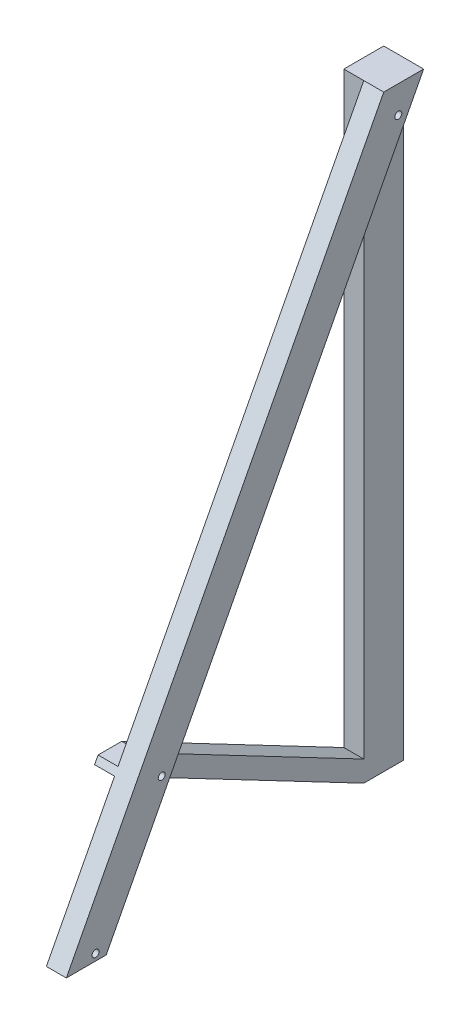
ISO-10303-21;
HEADER;
FILE_DESCRIPTION(('STEP AP214'),'2;1');
FILE_NAME('part.step','',(''),(''),'','','');
FILE_SCHEMA(('AUTOMOTIVE_DESIGN { 1 0 10303 214 1 1 1 1 }'));
ENDSEC;
DATA;
#1=APPLICATION_CONTEXT('core data for automotive mechanical design processes');
#2=APPLICATION_PROTOCOL_DEFINITION('international standard','automotive_design',2000,#1);
#3=PRODUCT_CONTEXT('',#1,'mechanical');
#4=PRODUCT('Part','Part','',(#3));
#5=PRODUCT_RELATED_PRODUCT_CATEGORY('part','',(#4));
#6=PRODUCT_DEFINITION_FORMATION('','',#4);
#7=PRODUCT_DEFINITION_CONTEXT('part definition',#1,'design');
#8=PRODUCT_DEFINITION('design','',#6,#7);
#9=PRODUCT_DEFINITION_SHAPE('','',#8);
#10=(LENGTH_UNIT() NAMED_UNIT(*) SI_UNIT(.MILLI.,.METRE.));
#11=(NAMED_UNIT(*) PLANE_ANGLE_UNIT() SI_UNIT($,.RADIAN.));
#12=(NAMED_UNIT(*) SI_UNIT($,.STERADIAN.) SOLID_ANGLE_UNIT());
#13=UNCERTAINTY_MEASURE_WITH_UNIT(LENGTH_MEASURE(1.E-05),#10,'distance_accuracy_value','');
#14=(GEOMETRIC_REPRESENTATION_CONTEXT(3) GLOBAL_UNCERTAINTY_ASSIGNED_CONTEXT((#13)) GLOBAL_UNIT_ASSIGNED_CONTEXT((#10,
#11,#12)) REPRESENTATION_CONTEXT('',''));
#15=CARTESIAN_POINT('',(0.,0.,0.));
#16=DIRECTION('',(0.,0.,1.));
#17=DIRECTION('',(1.,0.,0.));
#18=AXIS2_PLACEMENT_3D('',#15,#16,#17);
#19=CARTESIAN_POINT('',(0.,0.,0.));
#20=DIRECTION('',(1.,0.,0.));
#21=DIRECTION('',(0.,0.,-1.));
#22=AXIS2_PLACEMENT_3D('',#19,#20,#21);
#23=PLANE('',#22);
#24=DIRECTION('',(0.,1.,0.));
#25=VECTOR('',#24,1.);
#26=CARTESIAN_POINT('',(0.,0.,50.8));
#27=LINE('',#26,#25);
#28=CARTESIAN_POINT('',(0.,677.311225762122,50.8000000000001));
#29=VERTEX_POINT('',#28);
#30=CARTESIAN_POINT('',(0.,774.7,50.8));
#31=VERTEX_POINT('',#30);
#32=EDGE_CURVE('E150',#29,#31,#27,.T.);
#33=ORIENTED_EDGE('',*,*,#32,.F.);
#34=DIRECTION('',(0.,-0.886627906976744,0.462483464104435));
#35=VECTOR('',#34,1.);
#36=CARTESIAN_POINT('',(0.,165.701322505408,317.666312763722));
#37=LINE('',#36,#35);
#38=CARTESIAN_POINT('',(0.,166.407136563088,317.298145545162));
#39=VERTEX_POINT('',#38);
#40=EDGE_CURVE('E231',#29,#39,#37,.T.);
#41=ORIENTED_EDGE('',*,*,#40,.T.);
#42=DIRECTION('',(0.,0.464452291871962,0.885598141695703));
#43=VECTOR('',#42,1.);
#44=CARTESIAN_POINT('',(0.,0.,0.));
#45=LINE('',#44,#43);
#46=CARTESIAN_POINT('',(0.,174.895038051081,333.482519949616));
#47=VERTEX_POINT('',#46);
#48=EDGE_CURVE('E11',#39,#47,#45,.T.);
#49=ORIENTED_EDGE('',*,*,#48,.T.);
#50=DIRECTION('',(0.,0.,1.));
#51=VECTOR('',#50,1.);
#52=CARTESIAN_POINT('',(0.,174.895038051081,333.482519949616));
#53=LINE('',#52,#51);
#54=CARTESIAN_POINT('',(0.,174.895038051081,363.670680480894));
#55=VERTEX_POINT('',#54);
#56=EDGE_CURVE('E196',#47,#55,#53,.T.);
#57=ORIENTED_EDGE('',*,*,#56,.T.);
#58=DIRECTION('',(0.,-0.886627906976744,0.462483464104434));
#59=VECTOR('',#58,1.);
#60=CARTESIAN_POINT('',(0.,186.531900391554,357.600652271563));
#61=LINE('',#60,#59);
#62=EDGE_CURVE('E223',#31,#55,#61,.T.);
#63=ORIENTED_EDGE('',*,*,#62,.F.);
#64=EDGE_LOOP('',(#33,#41,#49,#57,#63));
#65=FACE_BOUND('',#64,.T.);
#66=ADVANCED_FACE('F35',(#65),#23,.F.);
#67=CARTESIAN_POINT('',(-25.4,0.,0.));
#68=DIRECTION('',(0.,0.885598141695703,-0.464452291871962));
#69=DIRECTION('',(0.,0.464452291871962,0.885598141695703));
#70=AXIS2_PLACEMENT_3D('',#67,#68,#69);
#71=PLANE('',#70);
#72=CARTESIAN_POINT('',(0.,26.6420798737434,50.8));
#73=VERTEX_POINT('',#72);
#74=EDGE_CURVE('E45',#73,#39,#45,.T.);
#75=ORIENTED_EDGE('',*,*,#74,.F.);
#76=DIRECTION('',(-1.,0.,0.));
#77=VECTOR('',#76,1.);
#78=CARTESIAN_POINT('',(-25.4,26.6420798737434,50.8));
#79=LINE('',#78,#77);
#80=CARTESIAN_POINT('',(-25.4,26.6420798737434,50.8));
#81=VERTEX_POINT('',#80);
#82=EDGE_CURVE('E142',#73,#81,#79,.T.);
#83=ORIENTED_EDGE('',*,*,#82,.T.);
#84=DIRECTION('',(0.,0.464452291871962,0.885598141695703));
#85=VECTOR('',#84,1.);
#86=CARTESIAN_POINT('',(-25.4,0.,0.));
#87=LINE('',#86,#85);
#88=CARTESIAN_POINT('',(-25.4,174.895038051081,333.482519949616));
#89=VERTEX_POINT('',#88);
#90=EDGE_CURVE('E140',#81,#89,#87,.T.);
#91=ORIENTED_EDGE('',*,*,#90,.T.);
#92=DIRECTION('',(1.,0.,0.));
#93=VECTOR('',#92,1.);
#94=CARTESIAN_POINT('',(-25.4,174.895038051081,333.482519949616));
#95=LINE('',#94,#93);
#96=EDGE_CURVE('E208',#89,#47,#95,.T.);
#97=ORIENTED_EDGE('',*,*,#96,.T.);
#98=ORIENTED_EDGE('',*,*,#48,.F.);
#99=EDGE_LOOP('',(#75,#83,#91,#97,#98));
#100=FACE_BOUND('',#99,.T.);
#101=ADVANCED_FACE('F258',(#100),#71,.T.);
#102=CARTESIAN_POINT('',(25.4,186.531900391554,357.600652271563));
#103=DIRECTION('',(0.,-0.462483464104434,-0.886627906976744));
#104=DIRECTION('',(0.,0.886627906976744,-0.462483464104434));
#105=AXIS2_PLACEMENT_3D('',#102,#103,#104);
#106=PLANE('',#105);
#107=ORIENTED_EDGE('',*,*,#62,.T.);
#108=DIRECTION('',(1.,0.,0.));
#109=VECTOR('',#108,1.);
#110=CARTESIAN_POINT('',(-25.4,174.895038051081,363.670680480894));
#111=LINE('',#110,#109);
#112=CARTESIAN_POINT('',(-25.4,174.895038051081,363.670680480894));
#113=VERTEX_POINT('',#112);
#114=EDGE_CURVE('E206',#113,#55,#111,.T.);
#115=ORIENTED_EDGE('',*,*,#114,.F.);
#116=DIRECTION('',(0.,-0.886627906976745,0.462483464104433));
#117=VECTOR('',#116,1.);
#118=CARTESIAN_POINT('',(-25.4,174.895038051081,363.670680480894));
#119=LINE('',#118,#117);
#120=CARTESIAN_POINT('',(-25.4,166.407136563088,368.098145545161));
#121=VERTEX_POINT('',#120);
#122=EDGE_CURVE('E187',#113,#121,#119,.T.);
#123=ORIENTED_EDGE('',*,*,#122,.T.);
#124=DIRECTION('',(1.,0.,0.));
#125=VECTOR('',#124,1.);
#126=CARTESIAN_POINT('',(-25.4,166.407136563088,368.098145545161));
#127=LINE('',#126,#125);
#128=CARTESIAN_POINT('',(0.,166.407136563088,368.098145545161));
#129=VERTEX_POINT('',#128);
#130=EDGE_CURVE('E204',#121,#129,#127,.T.);
#131=ORIENTED_EDGE('',*,*,#130,.T.);
#132=CARTESIAN_POINT('',(0.,0.,454.89955159589));
#133=VERTEX_POINT('',#132);
#134=EDGE_CURVE('E203',#129,#133,#61,.T.);
#135=ORIENTED_EDGE('',*,*,#134,.T.);
#136=DIRECTION('',(-1.,0.,0.));
#137=VECTOR('',#136,1.);
#138=CARTESIAN_POINT('',(25.4,0.,454.89955159589));
#139=LINE('',#138,#137);
#140=CARTESIAN_POINT('',(25.4,0.,454.89955159589));
#141=VERTEX_POINT('',#140);
#142=EDGE_CURVE('E39',#141,#133,#139,.T.);
#143=ORIENTED_EDGE('',*,*,#142,.F.);
#144=DIRECTION('',(0.,-0.886627906976744,0.462483464104434));
#145=VECTOR('',#144,1.);
#146=CARTESIAN_POINT('',(25.4,186.531900391554,357.600652271563));
#147=LINE('',#146,#145);
#148=CARTESIAN_POINT('',(25.4,774.7,50.8));
#149=VERTEX_POINT('',#148);
#150=EDGE_CURVE('E211',#149,#141,#147,.T.);
#151=ORIENTED_EDGE('',*,*,#150,.F.);
#152=DIRECTION('',(-1.,0.,0.));
#153=VECTOR('',#152,1.);
#154=CARTESIAN_POINT('',(25.4,774.7,50.8));
#155=LINE('',#154,#153);
#156=EDGE_CURVE('E222',#149,#31,#155,.T.);
#157=ORIENTED_EDGE('',*,*,#156,.T.);
#158=EDGE_LOOP('',(#107,#115,#123,#131,#135,#143,#151,#157));
#159=FACE_BOUND('',#158,.T.);
#160=ADVANCED_FACE('F37',(#159),#106,.F.);
#161=CARTESIAN_POINT('',(25.4,0.,0.));
#162=DIRECTION('',(0.,1.,0.));
#163=DIRECTION('',(0.,0.,1.));
#164=AXIS2_PLACEMENT_3D('',#161,#162,#163);
#165=PLANE('',#164);
#166=DIRECTION('',(0.,0.,-1.));
#167=VECTOR('',#166,1.);
#168=CARTESIAN_POINT('',(0.,0.,0.));
#169=LINE('',#168,#167);
#170=CARTESIAN_POINT('',(0.,0.,404.099551595891));
#171=VERTEX_POINT('',#170);
#172=EDGE_CURVE('E226',#133,#171,#169,.T.);
#173=ORIENTED_EDGE('',*,*,#172,.T.);
#174=DIRECTION('',(-1.,0.,0.));
#175=VECTOR('',#174,1.);
#176=CARTESIAN_POINT('',(25.4,0.,404.099551595891));
#177=LINE('',#176,#175);
#178=CARTESIAN_POINT('',(25.4,0.,404.099551595891));
#179=VERTEX_POINT('',#178);
#180=EDGE_CURVE('E235',#179,#171,#177,.T.);
#181=ORIENTED_EDGE('',*,*,#180,.F.);
#182=DIRECTION('',(0.,0.,-1.));
#183=VECTOR('',#182,1.);
#184=CARTESIAN_POINT('',(25.4,0.,0.));
#185=LINE('',#184,#183);
#186=EDGE_CURVE('E214',#141,#179,#185,.T.);
#187=ORIENTED_EDGE('',*,*,#186,.F.);
#188=ORIENTED_EDGE('',*,*,#142,.T.);
#189=EDGE_LOOP('',(#173,#181,#187,#188));
#190=FACE_BOUND('',#189,.T.);
#191=ADVANCED_FACE('F243',(#190),#165,.F.);
#192=CARTESIAN_POINT('',(25.4,165.701322505408,317.666312763722));
#193=DIRECTION('',(0.,-0.462483464104435,-0.886627906976744));
#194=DIRECTION('',(0.,0.886627906976744,-0.462483464104435));
#195=AXIS2_PLACEMENT_3D('',#192,#193,#194);
#196=PLANE('',#195);
#197=CARTESIAN_POINT('',(0.,774.7,0.));
#198=VERTEX_POINT('',#197);
#199=EDGE_CURVE('E215',#198,#29,#37,.T.);
#200=ORIENTED_EDGE('',*,*,#199,.F.);
#201=DIRECTION('',(-1.,0.,0.));
#202=VECTOR('',#201,1.);
#203=CARTESIAN_POINT('',(25.4,774.7,0.));
#204=LINE('',#203,#202);
#205=CARTESIAN_POINT('',(25.4,774.7,0.));
#206=VERTEX_POINT('',#205);
#207=EDGE_CURVE('E234',#206,#198,#204,.T.);
#208=ORIENTED_EDGE('',*,*,#207,.F.);
#209=DIRECTION('',(0.,-0.886627906976744,0.462483464104435));
#210=VECTOR('',#209,1.);
#211=CARTESIAN_POINT('',(25.4,165.701322505408,317.666312763722));
#212=LINE('',#211,#210);
#213=EDGE_CURVE('E217',#206,#179,#212,.T.);
#214=ORIENTED_EDGE('',*,*,#213,.T.);
#215=ORIENTED_EDGE('',*,*,#180,.T.);
#216=CARTESIAN_POINT('',(0.,145.487829664528,328.210088926348));
#217=VERTEX_POINT('',#216);
#218=EDGE_CURVE('E229',#217,#171,#37,.T.);
#219=ORIENTED_EDGE('',*,*,#218,.F.);
#220=EDGE_CURVE('E232',#39,#217,#37,.T.);
#221=ORIENTED_EDGE('',*,*,#220,.F.);
#222=ORIENTED_EDGE('',*,*,#40,.F.);
#223=EDGE_LOOP('',(#200,#208,#214,#215,#219,#221,#222));
#224=FACE_BOUND('',#223,.T.);
#225=ADVANCED_FACE('F261',(#224),#196,.T.);
#226=CARTESIAN_POINT('',(25.4,774.7,0.));
#227=DIRECTION('',(0.,-1.,0.));
#228=DIRECTION('',(0.,0.,-1.));
#229=AXIS2_PLACEMENT_3D('',#226,#227,#228);
#230=PLANE('',#229);
#231=ORIENTED_EDGE('',*,*,#207,.T.);
#232=DIRECTION('',(1.,0.,0.));
#233=VECTOR('',#232,1.);
#234=CARTESIAN_POINT('',(-801.763787151359,774.7,0.));
#235=LINE('',#234,#233);
#236=CARTESIAN_POINT('',(-25.4,774.7,0.));
#237=VERTEX_POINT('',#236);
#238=EDGE_CURVE('E158',#237,#198,#235,.T.);
#239=ORIENTED_EDGE('',*,*,#238,.F.);
#240=DIRECTION('',(0.,0.,-1.));
#241=VECTOR('',#240,1.);
#242=CARTESIAN_POINT('',(-25.4,774.7,0.));
#243=LINE('',#242,#241);
#244=CARTESIAN_POINT('',(-25.4,774.7,50.8));
#245=VERTEX_POINT('',#244);
#246=EDGE_CURVE('E138',#245,#237,#243,.T.);
#247=ORIENTED_EDGE('',*,*,#246,.F.);
#248=DIRECTION('',(1.,0.,0.));
#249=VECTOR('',#248,1.);
#250=CARTESIAN_POINT('',(-801.763787151359,774.7,50.8));
#251=LINE('',#250,#249);
#252=EDGE_CURVE('E146',#245,#31,#251,.T.);
#253=ORIENTED_EDGE('',*,*,#252,.T.);
#254=ORIENTED_EDGE('',*,*,#156,.F.);
#255=DIRECTION('',(0.,0.,1.));
#256=VECTOR('',#255,1.);
#257=CARTESIAN_POINT('',(25.4,774.7,0.));
#258=LINE('',#257,#256);
#259=EDGE_CURVE('E220',#206,#149,#258,.T.);
#260=ORIENTED_EDGE('',*,*,#259,.F.);
#261=EDGE_LOOP('',(#231,#239,#247,#253,#254,#260));
#262=FACE_BOUND('',#261,.T.);
#263=ADVANCED_FACE('F157',(#262),#230,.F.);
#264=CARTESIAN_POINT('',(25.4,0.,0.));
#265=DIRECTION('',(1.,0.,0.));
#266=DIRECTION('',(0.,0.,-1.));
#267=AXIS2_PLACEMENT_3D('',#264,#265,#266);
#268=PLANE('',#267);
#269=CARTESIAN_POINT('',(25.4,739.883035965228,32.2538826916237));
#270=DIRECTION('',(1.,0.,0.));
#271=DIRECTION('',(0.,0.,-1.));
#272=AXIS2_PLACEMENT_3D('',#269,#270,#271);
#273=CIRCLE('',#272,4.44499999999998);
#274=CARTESIAN_POINT('',(25.4,739.883035965228,27.8088826916237));
#275=VERTEX_POINT('',#274);
#276=EDGE_CURVE('E328',#275,#275,#273,.T.);
#277=ORIENTED_EDGE('',*,*,#276,.F.);
#278=EDGE_LOOP('',(#277));
#279=FACE_BOUND('',#278,.T.);
#280=CARTESIAN_POINT('',(25.4,8.40058422339496,417.66005931815));
#281=DIRECTION('',(-1.,0.,0.));
#282=DIRECTION('',(0.,0.,1.));
#283=AXIS2_PLACEMENT_3D('',#280,#281,#282);
#284=CIRCLE('',#283,4.445);
#285=CARTESIAN_POINT('',(25.4,8.40058422339496,422.10505931815));
#286=VERTEX_POINT('',#285);
#287=EDGE_CURVE('E168',#286,#286,#284,.T.);
#288=ORIENTED_EDGE('',*,*,#287,.T.);
#289=EDGE_LOOP('',(#288));
#290=FACE_BOUND('',#289,.T.);
#291=CARTESIAN_POINT('',(25.4,161.772531453813,333.482519949616));
#292=DIRECTION('',(1.,0.,0.));
#293=DIRECTION('',(0.,0.,-1.));
#294=AXIS2_PLACEMENT_3D('',#291,#292,#293);
#295=CIRCLE('',#294,4.38963066413441);
#296=CARTESIAN_POINT('',(25.4,161.772531453813,329.092889285482));
#297=VERTEX_POINT('',#296);
#298=EDGE_CURVE('E171',#297,#297,#295,.F.);
#299=ORIENTED_EDGE('',*,*,#298,.T.);
#300=EDGE_LOOP('',(#299));
#301=FACE_BOUND('',#300,.T.);
#302=ORIENTED_EDGE('',*,*,#150,.T.);
#303=ORIENTED_EDGE('',*,*,#186,.T.);
#304=ORIENTED_EDGE('',*,*,#213,.F.);
#305=ORIENTED_EDGE('',*,*,#259,.T.);
#306=EDGE_LOOP('',(#302,#303,#304,#305));
#307=FACE_BOUND('',#306,.T.);
#308=ADVANCED_FACE('F268',(#279,#290,#301,#307),#268,.T.);
#309=CARTESIAN_POINT('',(0.,8.40058422339496,417.66005931815));
#310=DIRECTION('',(-1.,0.,0.));
#311=DIRECTION('',(0.,0.,1.));
#312=AXIS2_PLACEMENT_3D('',#309,#310,#311);
#313=CIRCLE('',#312,4.445);
#314=CARTESIAN_POINT('',(0.,8.40058422339496,422.10505931815));
#315=VERTEX_POINT('',#314);
#316=EDGE_CURVE('E167',#315,#315,#313,.T.);
#317=ORIENTED_EDGE('',*,*,#316,.F.);
#318=EDGE_LOOP('',(#317));
#319=FACE_BOUND('',#318,.T.);
#320=ORIENTED_EDGE('',*,*,#134,.F.);
#321=DIRECTION('',(0.,-0.464452291871962,-0.885598141695703));
#322=VECTOR('',#321,1.);
#323=CARTESIAN_POINT('',(0.,166.407136563088,368.098145545161));
#324=LINE('',#323,#322);
#325=EDGE_CURVE('E182',#129,#217,#324,.T.);
#326=ORIENTED_EDGE('',*,*,#325,.T.);
#327=ORIENTED_EDGE('',*,*,#218,.T.);
#328=ORIENTED_EDGE('',*,*,#172,.F.);
#329=EDGE_LOOP('',(#320,#326,#327,#328));
#330=FACE_BOUND('',#329,.T.);
#331=ADVANCED_FACE('F249',(#319,#330),#23,.F.);
#332=CARTESIAN_POINT('',(0.,0.,0.));
#333=DIRECTION('',(-1.,0.,0.));
#334=DIRECTION('',(0.,0.,1.));
#335=AXIS2_PLACEMENT_3D('',#332,#333,#334);
#336=PLANE('',#335);
#337=DIRECTION('',(0.,0.,-1.));
#338=VECTOR('',#337,1.);
#339=CARTESIAN_POINT('',(0.,0.,50.8));
#340=LINE('',#339,#338);
#341=CARTESIAN_POINT('',(0.,0.,50.8));
#342=VERTEX_POINT('',#341);
#343=CARTESIAN_POINT('',(0.,0.,0.));
#344=VERTEX_POINT('',#343);
#345=EDGE_CURVE('E179',#342,#344,#340,.T.);
#346=ORIENTED_EDGE('',*,*,#345,.T.);
#347=DIRECTION('',(0.,-1.,0.));
#348=VECTOR('',#347,1.);
#349=CARTESIAN_POINT('',(0.,0.,0.));
#350=LINE('',#349,#348);
#351=EDGE_CURVE('E164',#198,#344,#350,.T.);
#352=ORIENTED_EDGE('',*,*,#351,.F.);
#353=ORIENTED_EDGE('',*,*,#199,.T.);
#354=EDGE_CURVE('E154',#73,#29,#27,.T.);
#355=ORIENTED_EDGE('',*,*,#354,.F.);
#356=ORIENTED_EDGE('',*,*,#74,.T.);
#357=ORIENTED_EDGE('',*,*,#220,.T.);
#358=EDGE_CURVE('E59',#217,#342,#324,.T.);
#359=ORIENTED_EDGE('',*,*,#358,.T.);
#360=EDGE_LOOP('',(#346,#352,#353,#355,#356,#357,#359));
#361=FACE_BOUND('',#360,.T.);
#362=ADVANCED_FACE('F257',(#361),#336,.F.);
#363=CARTESIAN_POINT('',(-25.4,0.,50.8));
#364=DIRECTION('',(0.,-1.,0.));
#365=DIRECTION('',(0.,0.,-1.));
#366=AXIS2_PLACEMENT_3D('',#363,#364,#365);
#367=PLANE('',#366);
#368=ORIENTED_EDGE('',*,*,#345,.F.);
#369=DIRECTION('',(1.,0.,0.));
#370=VECTOR('',#369,1.);
#371=CARTESIAN_POINT('',(-25.4,0.,50.8));
#372=LINE('',#371,#370);
#373=CARTESIAN_POINT('',(-25.4,0.,50.8));
#374=VERTEX_POINT('',#373);
#375=EDGE_CURVE('E201',#374,#342,#372,.T.);
#376=ORIENTED_EDGE('',*,*,#375,.F.);
#377=DIRECTION('',(0.,0.,-1.));
#378=VECTOR('',#377,1.);
#379=CARTESIAN_POINT('',(-25.4,0.,50.8));
#380=LINE('',#379,#378);
#381=CARTESIAN_POINT('',(-25.4,0.,0.));
#382=VERTEX_POINT('',#381);
#383=EDGE_CURVE('E180',#374,#382,#380,.T.);
#384=ORIENTED_EDGE('',*,*,#383,.T.);
#385=DIRECTION('',(1.,0.,0.));
#386=VECTOR('',#385,1.);
#387=CARTESIAN_POINT('',(-25.4,0.,0.));
#388=LINE('',#387,#386);
#389=EDGE_CURVE('E193',#382,#344,#388,.T.);
#390=ORIENTED_EDGE('',*,*,#389,.T.);
#391=EDGE_LOOP('',(#368,#376,#384,#390));
#392=FACE_BOUND('',#391,.T.);
#393=ADVANCED_FACE('F283',(#392),#367,.T.);
#394=CARTESIAN_POINT('',(-25.4,166.407136563088,368.098145545161));
#395=DIRECTION('',(0.,-0.885598141695703,0.464452291871962));
#396=DIRECTION('',(0.,-0.464452291871962,-0.885598141695703));
#397=AXIS2_PLACEMENT_3D('',#394,#395,#396);
#398=PLANE('',#397);
#399=ORIENTED_EDGE('',*,*,#325,.F.);
#400=ORIENTED_EDGE('',*,*,#130,.F.);
#401=DIRECTION('',(0.,-0.464452291871962,-0.885598141695703));
#402=VECTOR('',#401,1.);
#403=CARTESIAN_POINT('',(-25.4,166.407136563088,368.098145545161));
#404=LINE('',#403,#402);
#405=EDGE_CURVE('E190',#121,#374,#404,.T.);
#406=ORIENTED_EDGE('',*,*,#405,.T.);
#407=ORIENTED_EDGE('',*,*,#375,.T.);
#408=ORIENTED_EDGE('',*,*,#358,.F.);
#409=EDGE_LOOP('',(#399,#400,#406,#407,#408));
#410=FACE_BOUND('',#409,.T.);
#411=ADVANCED_FACE('F309',(#410),#398,.T.);
#412=CARTESIAN_POINT('',(-25.4,174.895038051081,333.482519949616));
#413=DIRECTION('',(0.,1.,0.));
#414=DIRECTION('',(0.,0.,1.));
#415=AXIS2_PLACEMENT_3D('',#412,#413,#414);
#416=PLANE('',#415);
#417=ORIENTED_EDGE('',*,*,#56,.F.);
#418=ORIENTED_EDGE('',*,*,#96,.F.);
#419=DIRECTION('',(0.,0.,1.));
#420=VECTOR('',#419,1.);
#421=CARTESIAN_POINT('',(-25.4,174.895038051081,333.482519949616));
#422=LINE('',#421,#420);
#423=EDGE_CURVE('E184',#89,#113,#422,.T.);
#424=ORIENTED_EDGE('',*,*,#423,.T.);
#425=ORIENTED_EDGE('',*,*,#114,.T.);
#426=EDGE_LOOP('',(#417,#418,#424,#425));
#427=FACE_BOUND('',#426,.T.);
#428=ADVANCED_FACE('F306',(#427),#416,.T.);
#429=CARTESIAN_POINT('',(-25.4,0.,0.));
#430=DIRECTION('',(-1.,0.,0.));
#431=DIRECTION('',(0.,0.,1.));
#432=AXIS2_PLACEMENT_3D('',#429,#430,#431);
#433=PLANE('',#432);
#434=CARTESIAN_POINT('',(-25.4,739.883035965228,32.2538826916237));
#435=DIRECTION('',(-1.,0.,0.));
#436=DIRECTION('',(0.,0.,1.));
#437=AXIS2_PLACEMENT_3D('',#434,#435,#436);
#438=CIRCLE('',#437,4.44499999999998);
#439=CARTESIAN_POINT('',(-25.4,739.883035965228,36.6988826916236));
#440=VERTEX_POINT('',#439);
#441=EDGE_CURVE('E165',#440,#440,#438,.F.);
#442=ORIENTED_EDGE('',*,*,#441,.T.);
#443=EDGE_LOOP('',(#442));
#444=FACE_BOUND('',#443,.T.);
#445=ORIENTED_EDGE('',*,*,#383,.F.);
#446=ORIENTED_EDGE('',*,*,#405,.F.);
#447=ORIENTED_EDGE('',*,*,#122,.F.);
#448=ORIENTED_EDGE('',*,*,#423,.F.);
#449=ORIENTED_EDGE('',*,*,#90,.F.);
#450=DIRECTION('',(0.,1.,0.));
#451=VECTOR('',#450,1.);
#452=CARTESIAN_POINT('',(-25.4,0.,50.8));
#453=LINE('',#452,#451);
#454=EDGE_CURVE('E131',#81,#245,#453,.T.);
#455=ORIENTED_EDGE('',*,*,#454,.T.);
#456=ORIENTED_EDGE('',*,*,#246,.T.);
#457=DIRECTION('',(0.,-1.,0.));
#458=VECTOR('',#457,1.);
#459=CARTESIAN_POINT('',(-25.4,0.,0.));
#460=LINE('',#459,#458);
#461=EDGE_CURVE('E143',#237,#382,#460,.T.);
#462=ORIENTED_EDGE('',*,*,#461,.T.);
#463=EDGE_LOOP('',(#445,#446,#447,#448,#449,#455,#456,#462));
#464=FACE_BOUND('',#463,.T.);
#465=CARTESIAN_POINT('',(-25.4,161.772531453813,333.482519949616));
#466=DIRECTION('',(1.,0.,0.));
#467=DIRECTION('',(0.,0.,-1.));
#468=AXIS2_PLACEMENT_3D('',#465,#466,#467);
#469=CIRCLE('',#468,4.38963066413441);
#470=CARTESIAN_POINT('',(-25.4,161.772531453813,329.092889285482));
#471=VERTEX_POINT('',#470);
#472=EDGE_CURVE('E176',#471,#471,#469,.T.);
#473=ORIENTED_EDGE('',*,*,#472,.T.);
#474=EDGE_LOOP('',(#473));
#475=FACE_BOUND('',#474,.T.);
#476=ADVANCED_FACE('F134',(#444,#464,#475),#433,.T.);
#477=CARTESIAN_POINT('',(-25.4,161.772531453813,333.482519949616));
#478=DIRECTION('',(1.,0.,0.));
#479=DIRECTION('',(0.,0.,-1.));
#480=AXIS2_PLACEMENT_3D('',#477,#478,#479);
#481=CYLINDRICAL_SURFACE('',#480,4.38963066413441);
#482=ORIENTED_EDGE('',*,*,#472,.F.);
#483=EDGE_LOOP('',(#482));
#484=FACE_BOUND('',#483,.T.);
#485=ORIENTED_EDGE('',*,*,#298,.F.);
#486=EDGE_LOOP('',(#485));
#487=FACE_BOUND('',#486,.T.);
#488=ADVANCED_FACE('F291',(#484,#487),#481,.F.);
#489=CARTESIAN_POINT('',(25.4,8.40058422339496,417.66005931815));
#490=DIRECTION('',(-1.,0.,0.));
#491=DIRECTION('',(0.,0.,1.));
#492=AXIS2_PLACEMENT_3D('',#489,#490,#491);
#493=CYLINDRICAL_SURFACE('',#492,4.445);
#494=ORIENTED_EDGE('',*,*,#287,.F.);
#495=EDGE_LOOP('',(#494));
#496=FACE_BOUND('',#495,.T.);
#497=ORIENTED_EDGE('',*,*,#316,.T.);
#498=EDGE_LOOP('',(#497));
#499=FACE_BOUND('',#498,.T.);
#500=ADVANCED_FACE('F288',(#496,#499),#493,.F.);
#501=CARTESIAN_POINT('',(-801.763787151359,0.,0.));
#502=DIRECTION('',(0.,0.,1.));
#503=DIRECTION('',(1.,0.,0.));
#504=AXIS2_PLACEMENT_3D('',#501,#502,#503);
#505=PLANE('',#504);
#506=ORIENTED_EDGE('',*,*,#461,.F.);
#507=ORIENTED_EDGE('',*,*,#238,.T.);
#508=ORIENTED_EDGE('',*,*,#351,.T.);
#509=ORIENTED_EDGE('',*,*,#389,.F.);
#510=EDGE_LOOP('',(#506,#507,#508,#509));
#511=FACE_BOUND('',#510,.T.);
#512=ADVANCED_FACE('F290',(#511),#505,.F.);
#513=CARTESIAN_POINT('',(-801.763787151359,0.,50.8));
#514=DIRECTION('',(0.,0.,-1.));
#515=DIRECTION('',(-1.,0.,0.));
#516=AXIS2_PLACEMENT_3D('',#513,#514,#515);
#517=PLANE('',#516);
#518=ORIENTED_EDGE('',*,*,#82,.F.);
#519=ORIENTED_EDGE('',*,*,#354,.T.);
#520=ORIENTED_EDGE('',*,*,#32,.T.);
#521=ORIENTED_EDGE('',*,*,#252,.F.);
#522=ORIENTED_EDGE('',*,*,#454,.F.);
#523=EDGE_LOOP('',(#518,#519,#520,#521,#522));
#524=FACE_BOUND('',#523,.T.);
#525=ADVANCED_FACE('F147',(#524),#517,.F.);
#526=CARTESIAN_POINT('',(-37.9723585694967,739.883035965228,32.2538826916237));
#527=DIRECTION('',(1.,0.,0.));
#528=DIRECTION('',(0.,0.,-1.));
#529=AXIS2_PLACEMENT_3D('',#526,#527,#528);
#530=CYLINDRICAL_SURFACE('',#529,4.44499999999998);
#531=ORIENTED_EDGE('',*,*,#276,.T.);
#532=EDGE_LOOP('',(#531));
#533=FACE_BOUND('',#532,.T.);
#534=ORIENTED_EDGE('',*,*,#441,.F.);
#535=EDGE_LOOP('',(#534));
#536=FACE_BOUND('',#535,.T.);
#537=ADVANCED_FACE('F332',(#533,#536),#530,.F.);
#538=CLOSED_SHELL('',(#66,#101,#160,#191,#225,#263,#308,#331,#362,#393,#411,#428,#476,#488,#500,
#512,#525,#537));
#539=MANIFOLD_SOLID_BREP('B2',#538);
#540=ADVANCED_BREP_SHAPE_REPRESENTATION('',(#18,#539),#14);
#541=SHAPE_DEFINITION_REPRESENTATION(#9,#540);
ENDSEC;
END-ISO-10303-21;
